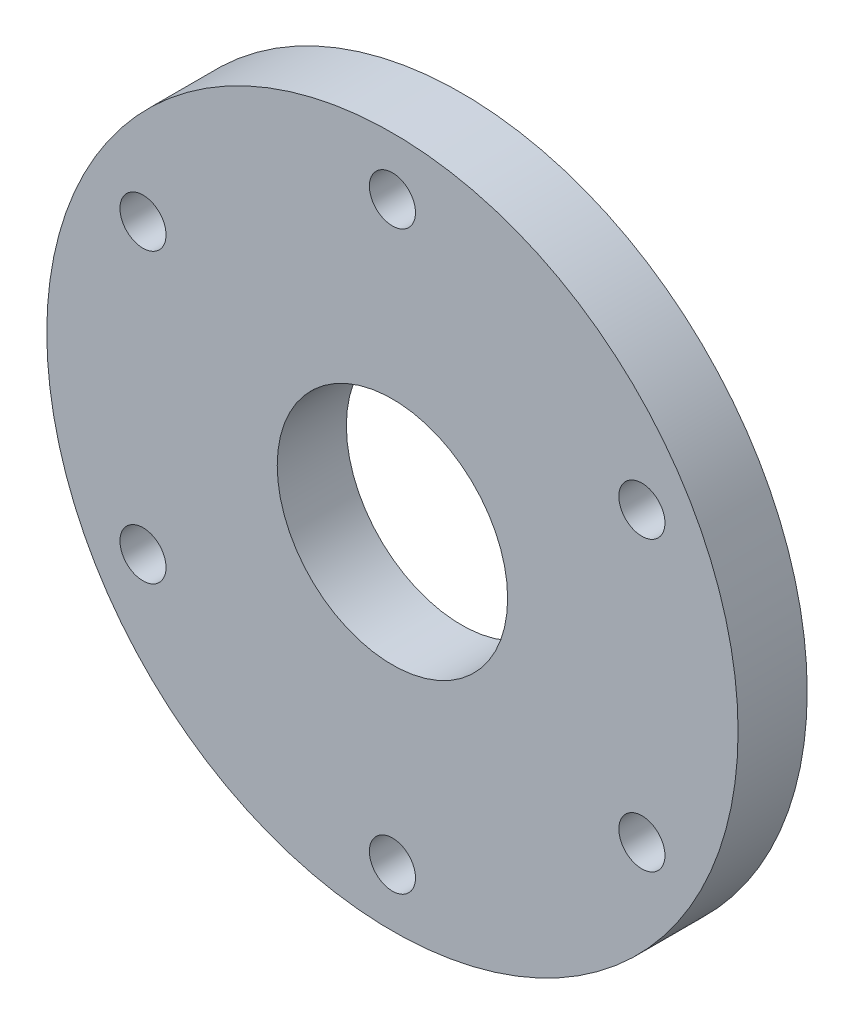
ISO-10303-21;
HEADER;
FILE_DESCRIPTION(('STEP AP214'),'2;1');
FILE_NAME('part.step','',(''),(''),'','','');
FILE_SCHEMA(('AUTOMOTIVE_DESIGN { 1 0 10303 214 1 1 1 1 }'));
ENDSEC;
DATA;
#1=APPLICATION_CONTEXT('core data for automotive mechanical design processes');
#2=APPLICATION_PROTOCOL_DEFINITION('international standard','automotive_design',2000,#1);
#3=PRODUCT_CONTEXT('',#1,'mechanical');
#4=PRODUCT('Part','Part','',(#3));
#5=PRODUCT_RELATED_PRODUCT_CATEGORY('part','',(#4));
#6=PRODUCT_DEFINITION_FORMATION('','',#4);
#7=PRODUCT_DEFINITION_CONTEXT('part definition',#1,'design');
#8=PRODUCT_DEFINITION('design','',#6,#7);
#9=PRODUCT_DEFINITION_SHAPE('','',#8);
#10=(LENGTH_UNIT() NAMED_UNIT(*) SI_UNIT(.MILLI.,.METRE.));
#11=(NAMED_UNIT(*) PLANE_ANGLE_UNIT() SI_UNIT($,.RADIAN.));
#12=(NAMED_UNIT(*) SI_UNIT($,.STERADIAN.) SOLID_ANGLE_UNIT());
#13=UNCERTAINTY_MEASURE_WITH_UNIT(LENGTH_MEASURE(1.E-05),#10,'distance_accuracy_value','');
#14=(GEOMETRIC_REPRESENTATION_CONTEXT(3) GLOBAL_UNCERTAINTY_ASSIGNED_CONTEXT((#13)) GLOBAL_UNIT_ASSIGNED_CONTEXT((#10,
#11,#12)) REPRESENTATION_CONTEXT('',''));
#15=CARTESIAN_POINT('',(0.,0.,0.));
#16=DIRECTION('',(0.,0.,1.));
#17=DIRECTION('',(1.,0.,0.));
#18=AXIS2_PLACEMENT_3D('',#15,#16,#17);
#19=CARTESIAN_POINT('',(0.,0.,6.));
#20=DIRECTION('',(0.,0.,1.));
#21=DIRECTION('',(1.,0.,0.));
#22=AXIS2_PLACEMENT_3D('',#19,#20,#21);
#23=PLANE('',#22);
#24=CARTESIAN_POINT('',(-21.6506350946094,-12.5000000000009,6.));
#25=DIRECTION('',(0.,0.,1.));
#26=DIRECTION('',(1.,0.,0.));
#27=AXIS2_PLACEMENT_3D('',#24,#25,#26);
#28=CIRCLE('',#27,2.00000000000202);
#29=CARTESIAN_POINT('',(-19.6506350946073,-12.5000000000009,6.));
#30=VERTEX_POINT('',#29);
#31=EDGE_CURVE('E71',#30,#30,#28,.T.);
#32=ORIENTED_EDGE('',*,*,#31,.F.);
#33=EDGE_LOOP('',(#32));
#34=FACE_BOUND('',#33,.T.);
#35=CARTESIAN_POINT('',(21.6506350946126,-12.4999999999991,6.));
#36=DIRECTION('',(0.,0.,1.));
#37=DIRECTION('',(1.,0.,0.));
#38=AXIS2_PLACEMENT_3D('',#35,#36,#37);
#39=CIRCLE('',#38,2.00000000000137);
#40=CARTESIAN_POINT('',(23.6506350946139,-12.4999999999991,6.));
#41=VERTEX_POINT('',#40);
#42=EDGE_CURVE('E59',#41,#41,#39,.T.);
#43=ORIENTED_EDGE('',*,*,#42,.F.);
#44=EDGE_LOOP('',(#43));
#45=FACE_BOUND('',#44,.T.);
#46=CARTESIAN_POINT('',(0.,25.,6.));
#47=DIRECTION('',(0.,0.,1.));
#48=DIRECTION('',(1.,0.,0.));
#49=AXIS2_PLACEMENT_3D('',#46,#47,#48);
#50=CIRCLE('',#49,2.);
#51=CARTESIAN_POINT('',(2.,25.,6.));
#52=VERTEX_POINT('',#51);
#53=EDGE_CURVE('E47',#52,#52,#50,.T.);
#54=ORIENTED_EDGE('',*,*,#53,.F.);
#55=EDGE_LOOP('',(#54));
#56=FACE_BOUND('',#55,.T.);
#57=CARTESIAN_POINT('',(0.,0.,6.));
#58=DIRECTION('',(0.,0.,1.));
#59=DIRECTION('',(1.,0.,0.));
#60=AXIS2_PLACEMENT_3D('',#57,#58,#59);
#61=CIRCLE('',#60,30.);
#62=CARTESIAN_POINT('',(30.,0.,6.));
#63=VERTEX_POINT('',#62);
#64=EDGE_CURVE('E10',#63,#63,#61,.T.);
#65=ORIENTED_EDGE('',*,*,#64,.T.);
#66=EDGE_LOOP('',(#65));
#67=FACE_BOUND('',#66,.T.);
#68=CARTESIAN_POINT('',(0.,0.,6.));
#69=DIRECTION('',(0.,0.,1.));
#70=DIRECTION('',(1.,0.,0.));
#71=AXIS2_PLACEMENT_3D('',#68,#69,#70);
#72=CIRCLE('',#71,10.);
#73=CARTESIAN_POINT('',(10.,0.,6.));
#74=VERTEX_POINT('',#73);
#75=EDGE_CURVE('E42',#74,#74,#72,.T.);
#76=ORIENTED_EDGE('',*,*,#75,.F.);
#77=EDGE_LOOP('',(#76));
#78=FACE_BOUND('',#77,.T.);
#79=CARTESIAN_POINT('',(21.6506350946115,12.5000000000009,6.));
#80=DIRECTION('',(0.,0.,1.));
#81=DIRECTION('',(1.,0.,0.));
#82=AXIS2_PLACEMENT_3D('',#79,#80,#81);
#83=CIRCLE('',#82,2.0000000000003);
#84=CARTESIAN_POINT('',(23.6506350946118,12.5000000000009,6.));
#85=VERTEX_POINT('',#84);
#86=EDGE_CURVE('E53',#85,#85,#83,.T.);
#87=ORIENTED_EDGE('',*,*,#86,.F.);
#88=EDGE_LOOP('',(#87));
#89=FACE_BOUND('',#88,.T.);
#90=CARTESIAN_POINT('',(2.1224433562867E-12,-25.,6.));
#91=DIRECTION('',(0.,0.,1.));
#92=DIRECTION('',(1.,0.,0.));
#93=AXIS2_PLACEMENT_3D('',#90,#91,#92);
#94=CIRCLE('',#93,2.0000000000022);
#95=CARTESIAN_POINT('',(2.00000000000432,-25.,6.));
#96=VERTEX_POINT('',#95);
#97=EDGE_CURVE('E65',#96,#96,#94,.T.);
#98=ORIENTED_EDGE('',*,*,#97,.F.);
#99=EDGE_LOOP('',(#98));
#100=FACE_BOUND('',#99,.T.);
#101=CARTESIAN_POINT('',(-21.6506350946104,12.4999999999991,6.));
#102=DIRECTION('',(0.,0.,1.));
#103=DIRECTION('',(1.,0.,0.));
#104=AXIS2_PLACEMENT_3D('',#101,#102,#103);
#105=CIRCLE('',#104,2.00000000000107);
#106=CARTESIAN_POINT('',(-19.6506350946094,12.4999999999991,6.));
#107=VERTEX_POINT('',#106);
#108=EDGE_CURVE('E77',#107,#107,#105,.T.);
#109=ORIENTED_EDGE('',*,*,#108,.F.);
#110=EDGE_LOOP('',(#109));
#111=FACE_BOUND('',#110,.T.);
#112=ADVANCED_FACE('F31',(#34,#45,#56,#67,#78,#89,#100,#111),#23,.T.);
#113=CARTESIAN_POINT('',(0.,0.,0.));
#114=DIRECTION('',(0.,0.,1.));
#115=DIRECTION('',(1.,0.,0.));
#116=AXIS2_PLACEMENT_3D('',#113,#114,#115);
#117=PLANE('',#116);
#118=CARTESIAN_POINT('',(0.,0.,0.));
#119=DIRECTION('',(0.,0.,1.));
#120=DIRECTION('',(1.,0.,0.));
#121=AXIS2_PLACEMENT_3D('',#118,#119,#120);
#122=CIRCLE('',#121,30.);
#123=CARTESIAN_POINT('',(30.,0.,0.));
#124=VERTEX_POINT('',#123);
#125=EDGE_CURVE('E35',#124,#124,#122,.T.);
#126=ORIENTED_EDGE('',*,*,#125,.F.);
#127=EDGE_LOOP('',(#126));
#128=FACE_BOUND('',#127,.T.);
#129=CARTESIAN_POINT('',(0.,0.,0.));
#130=DIRECTION('',(0.,0.,1.));
#131=DIRECTION('',(1.,0.,0.));
#132=AXIS2_PLACEMENT_3D('',#129,#130,#131);
#133=CIRCLE('',#132,10.);
#134=CARTESIAN_POINT('',(10.,0.,0.));
#135=VERTEX_POINT('',#134);
#136=EDGE_CURVE('E44',#135,#135,#133,.T.);
#137=ORIENTED_EDGE('',*,*,#136,.T.);
#138=EDGE_LOOP('',(#137));
#139=FACE_BOUND('',#138,.T.);
#140=CARTESIAN_POINT('',(0.,25.,0.));
#141=DIRECTION('',(0.,0.,1.));
#142=DIRECTION('',(1.,0.,0.));
#143=AXIS2_PLACEMENT_3D('',#140,#141,#142);
#144=CIRCLE('',#143,2.);
#145=CARTESIAN_POINT('',(2.,25.,0.));
#146=VERTEX_POINT('',#145);
#147=EDGE_CURVE('E50',#146,#146,#144,.T.);
#148=ORIENTED_EDGE('',*,*,#147,.T.);
#149=EDGE_LOOP('',(#148));
#150=FACE_BOUND('',#149,.T.);
#151=CARTESIAN_POINT('',(21.6506350946115,12.5000000000009,0.));
#152=DIRECTION('',(0.,0.,1.));
#153=DIRECTION('',(1.,0.,0.));
#154=AXIS2_PLACEMENT_3D('',#151,#152,#153);
#155=CIRCLE('',#154,2.0000000000003);
#156=CARTESIAN_POINT('',(23.6506350946118,12.5000000000009,0.));
#157=VERTEX_POINT('',#156);
#158=EDGE_CURVE('E56',#157,#157,#155,.T.);
#159=ORIENTED_EDGE('',*,*,#158,.T.);
#160=EDGE_LOOP('',(#159));
#161=FACE_BOUND('',#160,.T.);
#162=CARTESIAN_POINT('',(21.6506350946126,-12.4999999999991,0.));
#163=DIRECTION('',(0.,0.,1.));
#164=DIRECTION('',(1.,0.,0.));
#165=AXIS2_PLACEMENT_3D('',#162,#163,#164);
#166=CIRCLE('',#165,2.00000000000137);
#167=CARTESIAN_POINT('',(23.6506350946139,-12.4999999999991,0.));
#168=VERTEX_POINT('',#167);
#169=EDGE_CURVE('E62',#168,#168,#166,.T.);
#170=ORIENTED_EDGE('',*,*,#169,.T.);
#171=EDGE_LOOP('',(#170));
#172=FACE_BOUND('',#171,.T.);
#173=CARTESIAN_POINT('',(2.1224433562867E-12,-25.,0.));
#174=DIRECTION('',(0.,0.,1.));
#175=DIRECTION('',(1.,0.,0.));
#176=AXIS2_PLACEMENT_3D('',#173,#174,#175);
#177=CIRCLE('',#176,2.0000000000022);
#178=CARTESIAN_POINT('',(2.00000000000432,-25.,0.));
#179=VERTEX_POINT('',#178);
#180=EDGE_CURVE('E68',#179,#179,#177,.T.);
#181=ORIENTED_EDGE('',*,*,#180,.T.);
#182=EDGE_LOOP('',(#181));
#183=FACE_BOUND('',#182,.T.);
#184=CARTESIAN_POINT('',(-21.6506350946094,-12.5000000000009,0.));
#185=DIRECTION('',(0.,0.,1.));
#186=DIRECTION('',(1.,0.,0.));
#187=AXIS2_PLACEMENT_3D('',#184,#185,#186);
#188=CIRCLE('',#187,2.00000000000202);
#189=CARTESIAN_POINT('',(-19.6506350946073,-12.5000000000009,0.));
#190=VERTEX_POINT('',#189);
#191=EDGE_CURVE('E74',#190,#190,#188,.T.);
#192=ORIENTED_EDGE('',*,*,#191,.T.);
#193=EDGE_LOOP('',(#192));
#194=FACE_BOUND('',#193,.T.);
#195=CARTESIAN_POINT('',(-21.6506350946104,12.4999999999991,0.));
#196=DIRECTION('',(0.,0.,1.));
#197=DIRECTION('',(1.,0.,0.));
#198=AXIS2_PLACEMENT_3D('',#195,#196,#197);
#199=CIRCLE('',#198,2.00000000000107);
#200=CARTESIAN_POINT('',(-19.6506350946094,12.4999999999991,0.));
#201=VERTEX_POINT('',#200);
#202=EDGE_CURVE('E80',#201,#201,#199,.T.);
#203=ORIENTED_EDGE('',*,*,#202,.T.);
#204=EDGE_LOOP('',(#203));
#205=FACE_BOUND('',#204,.T.);
#206=ADVANCED_FACE('F90',(#128,#139,#150,#161,#172,#183,#194,#205),#117,.F.);
#207=CARTESIAN_POINT('',(0.,0.,6.));
#208=DIRECTION('',(0.,0.,-1.));
#209=DIRECTION('',(-1.,0.,0.));
#210=AXIS2_PLACEMENT_3D('',#207,#208,#209);
#211=CYLINDRICAL_SURFACE('',#210,30.);
#212=ORIENTED_EDGE('',*,*,#64,.F.);
#213=EDGE_LOOP('',(#212));
#214=FACE_BOUND('',#213,.T.);
#215=ORIENTED_EDGE('',*,*,#125,.T.);
#216=EDGE_LOOP('',(#215));
#217=FACE_BOUND('',#216,.T.);
#218=ADVANCED_FACE('F33',(#214,#217),#211,.T.);
#219=CARTESIAN_POINT('',(0.,0.,6.));
#220=DIRECTION('',(0.,0.,-1.));
#221=DIRECTION('',(-1.,0.,0.));
#222=AXIS2_PLACEMENT_3D('',#219,#220,#221);
#223=CYLINDRICAL_SURFACE('',#222,10.);
#224=ORIENTED_EDGE('',*,*,#75,.T.);
#225=EDGE_LOOP('',(#224));
#226=FACE_BOUND('',#225,.T.);
#227=ORIENTED_EDGE('',*,*,#136,.F.);
#228=EDGE_LOOP('',(#227));
#229=FACE_BOUND('',#228,.T.);
#230=ADVANCED_FACE('F100',(#226,#229),#223,.F.);
#231=CARTESIAN_POINT('',(0.,25.,6.));
#232=DIRECTION('',(0.,0.,-1.));
#233=DIRECTION('',(-1.,0.,0.));
#234=AXIS2_PLACEMENT_3D('',#231,#232,#233);
#235=CYLINDRICAL_SURFACE('',#234,2.);
#236=ORIENTED_EDGE('',*,*,#53,.T.);
#237=EDGE_LOOP('',(#236));
#238=FACE_BOUND('',#237,.T.);
#239=ORIENTED_EDGE('',*,*,#147,.F.);
#240=EDGE_LOOP('',(#239));
#241=FACE_BOUND('',#240,.T.);
#242=ADVANCED_FACE('F103',(#238,#241),#235,.F.);
#243=CARTESIAN_POINT('',(21.6506350946115,12.5000000000009,6.));
#244=DIRECTION('',(0.,0.,-1.));
#245=DIRECTION('',(-1.,0.,0.));
#246=AXIS2_PLACEMENT_3D('',#243,#244,#245);
#247=CYLINDRICAL_SURFACE('',#246,2.0000000000003);
#248=ORIENTED_EDGE('',*,*,#86,.T.);
#249=EDGE_LOOP('',(#248));
#250=FACE_BOUND('',#249,.T.);
#251=ORIENTED_EDGE('',*,*,#158,.F.);
#252=EDGE_LOOP('',(#251));
#253=FACE_BOUND('',#252,.T.);
#254=ADVANCED_FACE('F107',(#250,#253),#247,.F.);
#255=CARTESIAN_POINT('',(21.6506350946126,-12.4999999999991,6.));
#256=DIRECTION('',(0.,0.,-1.));
#257=DIRECTION('',(-1.,0.,0.));
#258=AXIS2_PLACEMENT_3D('',#255,#256,#257);
#259=CYLINDRICAL_SURFACE('',#258,2.00000000000137);
#260=ORIENTED_EDGE('',*,*,#42,.T.);
#261=EDGE_LOOP('',(#260));
#262=FACE_BOUND('',#261,.T.);
#263=ORIENTED_EDGE('',*,*,#169,.F.);
#264=EDGE_LOOP('',(#263));
#265=FACE_BOUND('',#264,.T.);
#266=ADVANCED_FACE('F111',(#262,#265),#259,.F.);
#267=CARTESIAN_POINT('',(2.1224433562867E-12,-25.,6.));
#268=DIRECTION('',(0.,0.,-1.));
#269=DIRECTION('',(-1.,0.,0.));
#270=AXIS2_PLACEMENT_3D('',#267,#268,#269);
#271=CYLINDRICAL_SURFACE('',#270,2.0000000000022);
#272=ORIENTED_EDGE('',*,*,#97,.T.);
#273=EDGE_LOOP('',(#272));
#274=FACE_BOUND('',#273,.T.);
#275=ORIENTED_EDGE('',*,*,#180,.F.);
#276=EDGE_LOOP('',(#275));
#277=FACE_BOUND('',#276,.T.);
#278=ADVANCED_FACE('F115',(#274,#277),#271,.F.);
#279=CARTESIAN_POINT('',(-21.6506350946094,-12.5000000000009,6.));
#280=DIRECTION('',(0.,0.,-1.));
#281=DIRECTION('',(-1.,0.,0.));
#282=AXIS2_PLACEMENT_3D('',#279,#280,#281);
#283=CYLINDRICAL_SURFACE('',#282,2.00000000000202);
#284=ORIENTED_EDGE('',*,*,#31,.T.);
#285=EDGE_LOOP('',(#284));
#286=FACE_BOUND('',#285,.T.);
#287=ORIENTED_EDGE('',*,*,#191,.F.);
#288=EDGE_LOOP('',(#287));
#289=FACE_BOUND('',#288,.T.);
#290=ADVANCED_FACE('F119',(#286,#289),#283,.F.);
#291=CARTESIAN_POINT('',(-21.6506350946104,12.4999999999991,6.));
#292=DIRECTION('',(0.,0.,-1.));
#293=DIRECTION('',(-1.,0.,0.));
#294=AXIS2_PLACEMENT_3D('',#291,#292,#293);
#295=CYLINDRICAL_SURFACE('',#294,2.00000000000107);
#296=ORIENTED_EDGE('',*,*,#108,.T.);
#297=EDGE_LOOP('',(#296));
#298=FACE_BOUND('',#297,.T.);
#299=ORIENTED_EDGE('',*,*,#202,.F.);
#300=EDGE_LOOP('',(#299));
#301=FACE_BOUND('',#300,.T.);
#302=ADVANCED_FACE('F86',(#298,#301),#295,.F.);
#303=CLOSED_SHELL('',(#112,#206,#218,#230,#242,#254,#266,#278,#290,#302));
#304=MANIFOLD_SOLID_BREP('B2',#303);
#305=ADVANCED_BREP_SHAPE_REPRESENTATION('',(#18,#304),#14);
#306=SHAPE_DEFINITION_REPRESENTATION(#9,#305);
ENDSEC;
END-ISO-10303-21;
